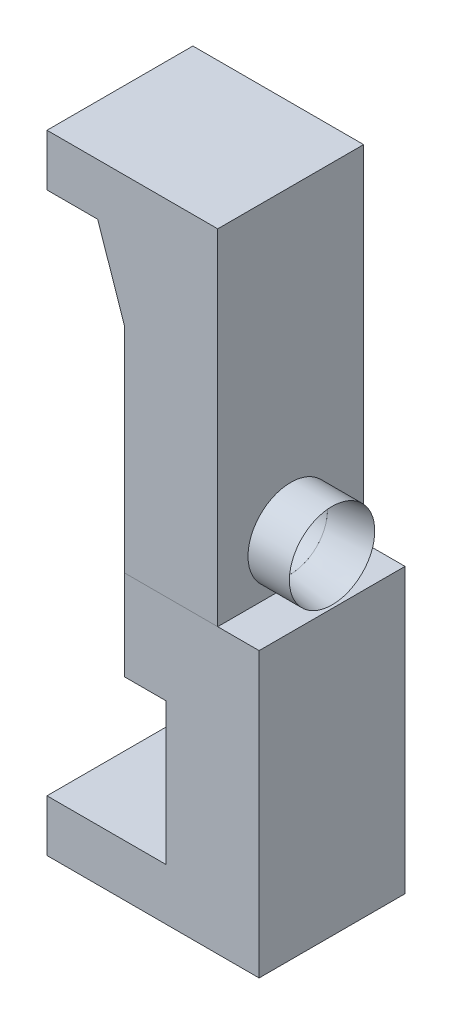
ISO-10303-21;
HEADER;
FILE_DESCRIPTION(('STEP AP214'),'2;1');
FILE_NAME('part.step','',(''),(''),'','','');
FILE_SCHEMA(('AUTOMOTIVE_DESIGN { 1 0 10303 214 1 1 1 1 }'));
ENDSEC;
DATA;
#1=APPLICATION_CONTEXT('core data for automotive mechanical design processes');
#2=APPLICATION_PROTOCOL_DEFINITION('international standard','automotive_design',2000,#1);
#3=PRODUCT_CONTEXT('',#1,'mechanical');
#4=PRODUCT('Part','Part','',(#3));
#5=PRODUCT_RELATED_PRODUCT_CATEGORY('part','',(#4));
#6=PRODUCT_DEFINITION_FORMATION('','',#4);
#7=PRODUCT_DEFINITION_CONTEXT('part definition',#1,'design');
#8=PRODUCT_DEFINITION('design','',#6,#7);
#9=PRODUCT_DEFINITION_SHAPE('','',#8);
#10=(LENGTH_UNIT() NAMED_UNIT(*) SI_UNIT(.MILLI.,.METRE.));
#11=(NAMED_UNIT(*) PLANE_ANGLE_UNIT() SI_UNIT($,.RADIAN.));
#12=(NAMED_UNIT(*) SI_UNIT($,.STERADIAN.) SOLID_ANGLE_UNIT());
#13=UNCERTAINTY_MEASURE_WITH_UNIT(LENGTH_MEASURE(1.E-05),#10,'distance_accuracy_value','');
#14=(GEOMETRIC_REPRESENTATION_CONTEXT(3) GLOBAL_UNCERTAINTY_ASSIGNED_CONTEXT((#13)) GLOBAL_UNIT_ASSIGNED_CONTEXT((#10,
#11,#12)) REPRESENTATION_CONTEXT('',''));
#15=CARTESIAN_POINT('',(0.,0.,0.));
#16=DIRECTION('',(0.,0.,1.));
#17=DIRECTION('',(1.,0.,0.));
#18=AXIS2_PLACEMENT_3D('',#15,#16,#17);
#19=CARTESIAN_POINT('',(0.,28.875,7.05));
#20=DIRECTION('',(0.,1.,0.));
#21=DIRECTION('',(0.,0.,1.));
#22=AXIS2_PLACEMENT_3D('',#19,#20,#21);
#23=PLANE('',#22);
#24=DIRECTION('',(1.,0.,0.));
#25=VECTOR('',#24,1.);
#26=CARTESIAN_POINT('',(0.,28.875,-7.05));
#27=LINE('',#26,#25);
#28=CARTESIAN_POINT('',(-7.5,28.875,-7.05));
#29=VERTEX_POINT('',#28);
#30=CARTESIAN_POINT('',(8.99999999999999,28.875,-7.05));
#31=VERTEX_POINT('',#30);
#32=EDGE_CURVE('E137',#29,#31,#27,.T.);
#33=ORIENTED_EDGE('',*,*,#32,.F.);
#34=DIRECTION('',(0.,0.,-1.));
#35=VECTOR('',#34,1.);
#36=CARTESIAN_POINT('',(-7.5,28.875,7.05));
#37=LINE('',#36,#35);
#38=CARTESIAN_POINT('',(-7.5,28.875,7.05));
#39=VERTEX_POINT('',#38);
#40=EDGE_CURVE('E12',#39,#29,#37,.T.);
#41=ORIENTED_EDGE('',*,*,#40,.F.);
#42=DIRECTION('',(1.,0.,0.));
#43=VECTOR('',#42,1.);
#44=CARTESIAN_POINT('',(0.,28.875,7.05));
#45=LINE('',#44,#43);
#46=CARTESIAN_POINT('',(8.99999999999999,28.875,7.05));
#47=VERTEX_POINT('',#46);
#48=EDGE_CURVE('E176',#39,#47,#45,.T.);
#49=ORIENTED_EDGE('',*,*,#48,.T.);
#50=DIRECTION('',(0.,0.,1.));
#51=VECTOR('',#50,1.);
#52=CARTESIAN_POINT('',(8.99999999999999,28.875,0.));
#53=LINE('',#52,#51);
#54=EDGE_CURVE('E129',#31,#47,#53,.T.);
#55=ORIENTED_EDGE('',*,*,#54,.F.);
#56=EDGE_LOOP('',(#33,#41,#49,#55));
#57=FACE_BOUND('',#56,.T.);
#58=ADVANCED_FACE('F48',(#57),#23,.T.);
#59=CARTESIAN_POINT('',(-7.5,0.,7.05));
#60=DIRECTION('',(-1.,0.,0.));
#61=DIRECTION('',(0.,0.,1.));
#62=AXIS2_PLACEMENT_3D('',#59,#60,#61);
#63=PLANE('',#62);
#64=DIRECTION('',(0.,1.,0.));
#65=VECTOR('',#64,1.);
#66=CARTESIAN_POINT('',(-7.5,0.,-7.05));
#67=LINE('',#66,#65);
#68=CARTESIAN_POINT('',(-7.5,23.875,-7.05));
#69=VERTEX_POINT('',#68);
#70=EDGE_CURVE('E139',#69,#29,#67,.T.);
#71=ORIENTED_EDGE('',*,*,#70,.F.);
#72=DIRECTION('',(0.,0.,-1.));
#73=VECTOR('',#72,1.);
#74=CARTESIAN_POINT('',(-7.5,23.875,7.05));
#75=LINE('',#74,#73);
#76=CARTESIAN_POINT('',(-7.5,23.875,7.05));
#77=VERTEX_POINT('',#76);
#78=EDGE_CURVE('E57',#77,#69,#75,.T.);
#79=ORIENTED_EDGE('',*,*,#78,.F.);
#80=DIRECTION('',(0.,1.,0.));
#81=VECTOR('',#80,1.);
#82=CARTESIAN_POINT('',(-7.5,0.,7.05));
#83=LINE('',#82,#81);
#84=EDGE_CURVE('E177',#77,#39,#83,.T.);
#85=ORIENTED_EDGE('',*,*,#84,.T.);
#86=ORIENTED_EDGE('',*,*,#40,.T.);
#87=EDGE_LOOP('',(#71,#79,#85,#86));
#88=FACE_BOUND('',#87,.T.);
#89=ADVANCED_FACE('F184',(#88),#63,.T.);
#90=CARTESIAN_POINT('',(0.,23.875,7.05));
#91=DIRECTION('',(0.,-1.,0.));
#92=DIRECTION('',(0.,0.,-1.));
#93=AXIS2_PLACEMENT_3D('',#90,#91,#92);
#94=PLANE('',#93);
#95=DIRECTION('',(-1.,0.,0.));
#96=VECTOR('',#95,1.);
#97=CARTESIAN_POINT('',(0.,23.875,-7.05));
#98=LINE('',#97,#96);
#99=CARTESIAN_POINT('',(-2.6,23.875,-7.05));
#100=VERTEX_POINT('',#99);
#101=EDGE_CURVE('E173',#100,#69,#98,.T.);
#102=ORIENTED_EDGE('',*,*,#101,.F.);
#103=DIRECTION('',(0.,0.,-1.));
#104=VECTOR('',#103,1.);
#105=CARTESIAN_POINT('',(-2.6,23.875,7.05));
#106=LINE('',#105,#104);
#107=CARTESIAN_POINT('',(-2.6,23.875,7.05));
#108=VERTEX_POINT('',#107);
#109=EDGE_CURVE('E84',#108,#100,#106,.T.);
#110=ORIENTED_EDGE('',*,*,#109,.F.);
#111=DIRECTION('',(-1.,0.,0.));
#112=VECTOR('',#111,1.);
#113=CARTESIAN_POINT('',(0.,23.875,7.05));
#114=LINE('',#113,#112);
#115=EDGE_CURVE('E166',#108,#77,#114,.T.);
#116=ORIENTED_EDGE('',*,*,#115,.T.);
#117=ORIENTED_EDGE('',*,*,#78,.T.);
#118=EDGE_LOOP('',(#102,#110,#116,#117));
#119=FACE_BOUND('',#118,.T.);
#120=ADVANCED_FACE('F186',(#119),#94,.T.);
#121=CARTESIAN_POINT('',(4.94336537356872,1.68009803546127,7.05));
#122=DIRECTION('',(-0.946810458349171,-0.321791789765731,0.));
#123=DIRECTION('',(0.321791789765731,-0.946810458349171,0.));
#124=AXIS2_PLACEMENT_3D('',#121,#122,#123);
#125=PLANE('',#124);
#126=DIRECTION('',(-0.321791789765731,0.946810458349171,0.));
#127=VECTOR('',#126,1.);
#128=CARTESIAN_POINT('',(4.94336537356872,1.68009803546127,-7.05));
#129=LINE('',#128,#127);
#130=CARTESIAN_POINT('',(0.,16.225,-7.05));
#131=VERTEX_POINT('',#130);
#132=EDGE_CURVE('E160',#131,#100,#129,.T.);
#133=ORIENTED_EDGE('',*,*,#132,.F.);
#134=DIRECTION('',(0.,0.,-1.));
#135=VECTOR('',#134,1.);
#136=CARTESIAN_POINT('',(0.,16.225,7.05));
#137=LINE('',#136,#135);
#138=CARTESIAN_POINT('',(0.,16.225,7.05));
#139=VERTEX_POINT('',#138);
#140=EDGE_CURVE('E66',#139,#131,#137,.T.);
#141=ORIENTED_EDGE('',*,*,#140,.F.);
#142=DIRECTION('',(-0.321791789765731,0.946810458349171,0.));
#143=VECTOR('',#142,1.);
#144=CARTESIAN_POINT('',(4.94336537356872,1.68009803546127,7.05));
#145=LINE('',#144,#143);
#146=EDGE_CURVE('E163',#139,#108,#145,.T.);
#147=ORIENTED_EDGE('',*,*,#146,.T.);
#148=ORIENTED_EDGE('',*,*,#109,.T.);
#149=EDGE_LOOP('',(#133,#141,#147,#148));
#150=FACE_BOUND('',#149,.T.);
#151=ADVANCED_FACE('F188',(#150),#125,.T.);
#152=CARTESIAN_POINT('',(0.,0.,7.05));
#153=DIRECTION('',(0.,0.,1.));
#154=DIRECTION('',(1.,0.,0.));
#155=AXIS2_PLACEMENT_3D('',#152,#153,#154);
#156=PLANE('',#155);
#157=ORIENTED_EDGE('',*,*,#146,.F.);
#158=DIRECTION('',(0.,-1.,0.));
#159=VECTOR('',#158,1.);
#160=CARTESIAN_POINT('',(0.,0.,7.05));
#161=LINE('',#160,#159);
#162=CARTESIAN_POINT('',(0.,-4.425,7.05));
#163=VERTEX_POINT('',#162);
#164=EDGE_CURVE('E135',#139,#163,#161,.T.);
#165=ORIENTED_EDGE('',*,*,#164,.T.);
#166=DIRECTION('',(-1.,0.,0.));
#167=VECTOR('',#166,1.);
#168=CARTESIAN_POINT('',(9.,-4.425,7.05));
#169=LINE('',#168,#167);
#170=CARTESIAN_POINT('',(9.,-4.425,7.05));
#171=VERTEX_POINT('',#170);
#172=EDGE_CURVE('E116',#171,#163,#169,.T.);
#173=ORIENTED_EDGE('',*,*,#172,.F.);
#174=DIRECTION('',(0.,-1.,0.));
#175=VECTOR('',#174,1.);
#176=CARTESIAN_POINT('',(9.,0.,7.05));
#177=LINE('',#176,#175);
#178=EDGE_CURVE('E123',#47,#171,#177,.T.);
#179=ORIENTED_EDGE('',*,*,#178,.F.);
#180=ORIENTED_EDGE('',*,*,#48,.F.);
#181=ORIENTED_EDGE('',*,*,#84,.F.);
#182=ORIENTED_EDGE('',*,*,#115,.F.);
#183=EDGE_LOOP('',(#157,#165,#173,#179,#180,#181,#182));
#184=FACE_BOUND('',#183,.T.);
#185=ADVANCED_FACE('F133',(#184),#156,.T.);
#186=CARTESIAN_POINT('',(0.,0.,-7.05));
#187=DIRECTION('',(0.,0.,1.));
#188=DIRECTION('',(1.,0.,0.));
#189=AXIS2_PLACEMENT_3D('',#186,#187,#188);
#190=PLANE('',#189);
#191=ORIENTED_EDGE('',*,*,#32,.T.);
#192=DIRECTION('',(0.,1.,0.));
#193=VECTOR('',#192,1.);
#194=CARTESIAN_POINT('',(9.,0.,-7.05));
#195=LINE('',#194,#193);
#196=CARTESIAN_POINT('',(9.,-4.425,-7.05));
#197=VERTEX_POINT('',#196);
#198=EDGE_CURVE('E122',#197,#31,#195,.T.);
#199=ORIENTED_EDGE('',*,*,#198,.F.);
#200=DIRECTION('',(-1.,0.,0.));
#201=VECTOR('',#200,1.);
#202=CARTESIAN_POINT('',(9.,-4.425,-7.05));
#203=LINE('',#202,#201);
#204=CARTESIAN_POINT('',(0.,-4.425,-7.05));
#205=VERTEX_POINT('',#204);
#206=EDGE_CURVE('E118',#197,#205,#203,.T.);
#207=ORIENTED_EDGE('',*,*,#206,.T.);
#208=DIRECTION('',(0.,1.,0.));
#209=VECTOR('',#208,1.);
#210=CARTESIAN_POINT('',(0.,0.,-7.05));
#211=LINE('',#210,#209);
#212=EDGE_CURVE('E131',#205,#131,#211,.T.);
#213=ORIENTED_EDGE('',*,*,#212,.T.);
#214=ORIENTED_EDGE('',*,*,#132,.T.);
#215=ORIENTED_EDGE('',*,*,#101,.T.);
#216=ORIENTED_EDGE('',*,*,#70,.T.);
#217=EDGE_LOOP('',(#191,#199,#207,#213,#214,#215,#216));
#218=FACE_BOUND('',#217,.T.);
#219=ADVANCED_FACE('F158',(#218),#190,.F.);
#220=CARTESIAN_POINT('',(0.,0.,0.));
#221=DIRECTION('',(1.,0.,0.));
#222=DIRECTION('',(0.,1.,0.));
#223=AXIS2_PLACEMENT_3D('',#220,#221,#222);
#224=PLANE('',#223);
#225=CARTESIAN_POINT('',(0.,0.,0.));
#226=DIRECTION('',(1.,0.,0.));
#227=DIRECTION('',(0.,1.,0.));
#228=AXIS2_PLACEMENT_3D('',#225,#226,#227);
#229=CIRCLE('',#228,3.55);
#230=CARTESIAN_POINT('',(0.,3.55,0.));
#231=VERTEX_POINT('',#230);
#232=EDGE_CURVE('E147',#231,#231,#229,.T.);
#233=ORIENTED_EDGE('',*,*,#232,.T.);
#234=EDGE_LOOP('',(#233));
#235=FACE_BOUND('',#234,.T.);
#236=ORIENTED_EDGE('',*,*,#164,.F.);
#237=ORIENTED_EDGE('',*,*,#140,.T.);
#238=ORIENTED_EDGE('',*,*,#212,.F.);
#239=DIRECTION('',(0.,0.,-1.));
#240=VECTOR('',#239,1.);
#241=CARTESIAN_POINT('',(0.,-4.425,0.));
#242=LINE('',#241,#240);
#243=EDGE_CURVE('E146',#163,#205,#242,.T.);
#244=ORIENTED_EDGE('',*,*,#243,.F.);
#245=EDGE_LOOP('',(#236,#237,#238,#244));
#246=FACE_BOUND('',#245,.T.);
#247=ADVANCED_FACE('F162',(#235,#246),#224,.F.);
#248=CARTESIAN_POINT('',(9.,-4.425,0.));
#249=DIRECTION('',(0.,1.,0.));
#250=DIRECTION('',(-1.,0.,0.));
#251=AXIS2_PLACEMENT_3D('',#248,#249,#250);
#252=PLANE('',#251);
#253=ORIENTED_EDGE('',*,*,#243,.T.);
#254=ORIENTED_EDGE('',*,*,#206,.F.);
#255=DIRECTION('',(0.,0.,-1.));
#256=VECTOR('',#255,1.);
#257=CARTESIAN_POINT('',(9.,-4.425,0.));
#258=LINE('',#257,#256);
#259=EDGE_CURVE('E112',#171,#197,#258,.T.);
#260=ORIENTED_EDGE('',*,*,#259,.F.);
#261=ORIENTED_EDGE('',*,*,#172,.T.);
#262=EDGE_LOOP('',(#253,#254,#260,#261));
#263=FACE_BOUND('',#262,.T.);
#264=ADVANCED_FACE('F114',(#263),#252,.F.);
#265=CARTESIAN_POINT('',(9.,0.,0.));
#266=DIRECTION('',(1.,0.,0.));
#267=DIRECTION('',(0.,1.,0.));
#268=AXIS2_PLACEMENT_3D('',#265,#266,#267);
#269=PLANE('',#268);
#270=CARTESIAN_POINT('',(9.,0.,0.));
#271=DIRECTION('',(1.,0.,0.));
#272=DIRECTION('',(0.,1.,0.));
#273=AXIS2_PLACEMENT_3D('',#270,#271,#272);
#274=CIRCLE('',#273,3.55);
#275=CARTESIAN_POINT('',(9.,3.55,0.));
#276=VERTEX_POINT('',#275);
#277=EDGE_CURVE('E199',#276,#276,#274,.T.);
#278=ORIENTED_EDGE('',*,*,#277,.F.);
#279=EDGE_LOOP('',(#278));
#280=FACE_BOUND('',#279,.T.);
#281=ORIENTED_EDGE('',*,*,#178,.T.);
#282=ORIENTED_EDGE('',*,*,#259,.T.);
#283=ORIENTED_EDGE('',*,*,#198,.T.);
#284=ORIENTED_EDGE('',*,*,#54,.T.);
#285=EDGE_LOOP('',(#281,#282,#283,#284));
#286=FACE_BOUND('',#285,.T.);
#287=ADVANCED_FACE('F127',(#280,#286),#269,.T.);
#288=CARTESIAN_POINT('',(0.,0.,0.));
#289=DIRECTION('',(1.,0.,0.));
#290=DIRECTION('',(0.,1.,0.));
#291=AXIS2_PLACEMENT_3D('',#288,#289,#290);
#292=CYLINDRICAL_SURFACE('',#291,3.55);
#293=ORIENTED_EDGE('',*,*,#232,.F.);
#294=EDGE_LOOP('',(#293));
#295=FACE_BOUND('',#294,.T.);
#296=ORIENTED_EDGE('',*,*,#277,.T.);
#297=EDGE_LOOP('',(#296));
#298=FACE_BOUND('',#297,.T.);
#299=ADVANCED_FACE('F206',(#295,#298),#292,.F.);
#300=CLOSED_SHELL('',(#58,#89,#120,#151,#185,#219,#247,#264,#287,#299));
#301=MANIFOLD_SOLID_BREP('B2',#300);
#302=CARTESIAN_POINT('',(0.,-4.425,7.05));
#303=DIRECTION('',(0.,1.,0.));
#304=DIRECTION('',(0.,0.,1.));
#305=AXIS2_PLACEMENT_3D('',#302,#303,#304);
#306=PLANE('',#305);
#307=DIRECTION('',(1.,0.,0.));
#308=VECTOR('',#307,1.);
#309=CARTESIAN_POINT('',(0.,-4.425,-7.05));
#310=LINE('',#309,#308);
#311=CARTESIAN_POINT('',(0.,-4.425,-7.05));
#312=VERTEX_POINT('',#311);
#313=CARTESIAN_POINT('',(13.,-4.425,-7.05));
#314=VERTEX_POINT('',#313);
#315=EDGE_CURVE('E405',#312,#314,#310,.T.);
#316=ORIENTED_EDGE('',*,*,#315,.F.);
#317=DIRECTION('',(0.,0.,-1.));
#318=VECTOR('',#317,1.);
#319=CARTESIAN_POINT('',(0.,-4.425,7.05));
#320=LINE('',#319,#318);
#321=CARTESIAN_POINT('',(0.,-4.425,7.05));
#322=VERTEX_POINT('',#321);
#323=EDGE_CURVE('E46',#322,#312,#320,.T.);
#324=ORIENTED_EDGE('',*,*,#323,.F.);
#325=DIRECTION('',(1.,0.,0.));
#326=VECTOR('',#325,1.);
#327=CARTESIAN_POINT('',(0.,-4.425,7.05));
#328=LINE('',#327,#326);
#329=CARTESIAN_POINT('',(13.,-4.425,7.05));
#330=VERTEX_POINT('',#329);
#331=EDGE_CURVE('E422',#322,#330,#328,.T.);
#332=ORIENTED_EDGE('',*,*,#331,.T.);
#333=DIRECTION('',(0.,0.,-1.));
#334=VECTOR('',#333,1.);
#335=CARTESIAN_POINT('',(13.,-4.425,7.05));
#336=LINE('',#335,#334);
#337=EDGE_CURVE('E362',#330,#314,#336,.T.);
#338=ORIENTED_EDGE('',*,*,#337,.T.);
#339=EDGE_LOOP('',(#316,#324,#332,#338));
#340=FACE_BOUND('',#339,.T.);
#341=ADVANCED_FACE('F312',(#340),#306,.T.);
#342=CARTESIAN_POINT('',(0.,0.,7.05));
#343=DIRECTION('',(-1.,0.,0.));
#344=DIRECTION('',(0.,0.,1.));
#345=AXIS2_PLACEMENT_3D('',#342,#343,#344);
#346=PLANE('',#345);
#347=DIRECTION('',(0.,1.,0.));
#348=VECTOR('',#347,1.);
#349=CARTESIAN_POINT('',(0.,0.,-7.05));
#350=LINE('',#349,#348);
#351=CARTESIAN_POINT('',(0.,-13.125,-7.05));
#352=VERTEX_POINT('',#351);
#353=EDGE_CURVE('E408',#352,#312,#350,.T.);
#354=ORIENTED_EDGE('',*,*,#353,.F.);
#355=DIRECTION('',(0.,0.,-1.));
#356=VECTOR('',#355,1.);
#357=CARTESIAN_POINT('',(0.,-13.125,7.05));
#358=LINE('',#357,#356);
#359=CARTESIAN_POINT('',(0.,-13.125,7.05));
#360=VERTEX_POINT('',#359);
#361=EDGE_CURVE('E320',#360,#352,#358,.T.);
#362=ORIENTED_EDGE('',*,*,#361,.F.);
#363=DIRECTION('',(0.,1.,0.));
#364=VECTOR('',#363,1.);
#365=CARTESIAN_POINT('',(0.,0.,7.05));
#366=LINE('',#365,#364);
#367=EDGE_CURVE('E446',#360,#322,#366,.T.);
#368=ORIENTED_EDGE('',*,*,#367,.T.);
#369=ORIENTED_EDGE('',*,*,#323,.T.);
#370=EDGE_LOOP('',(#354,#362,#368,#369));
#371=FACE_BOUND('',#370,.T.);
#372=ADVANCED_FACE('F445',(#371),#346,.T.);
#373=CARTESIAN_POINT('',(0.,-13.125,7.05));
#374=DIRECTION('',(0.,1.,0.));
#375=DIRECTION('',(0.,0.,1.));
#376=AXIS2_PLACEMENT_3D('',#373,#374,#375);
#377=PLANE('',#376);
#378=DIRECTION('',(1.,0.,0.));
#379=VECTOR('',#378,1.);
#380=CARTESIAN_POINT('',(0.,-13.125,-7.05));
#381=LINE('',#380,#379);
#382=CARTESIAN_POINT('',(4.,-13.125,-7.05));
#383=VERTEX_POINT('',#382);
#384=EDGE_CURVE('E411',#352,#383,#381,.T.);
#385=ORIENTED_EDGE('',*,*,#384,.T.);
#386=DIRECTION('',(0.,0.,-1.));
#387=VECTOR('',#386,1.);
#388=CARTESIAN_POINT('',(4.,-13.125,7.05));
#389=LINE('',#388,#387);
#390=CARTESIAN_POINT('',(4.,-13.125,7.05));
#391=VERTEX_POINT('',#390);
#392=EDGE_CURVE('E429',#391,#383,#389,.T.);
#393=ORIENTED_EDGE('',*,*,#392,.F.);
#394=DIRECTION('',(1.,0.,0.));
#395=VECTOR('',#394,1.);
#396=CARTESIAN_POINT('',(0.,-13.125,7.05));
#397=LINE('',#396,#395);
#398=EDGE_CURVE('E436',#360,#391,#397,.T.);
#399=ORIENTED_EDGE('',*,*,#398,.F.);
#400=ORIENTED_EDGE('',*,*,#361,.T.);
#401=EDGE_LOOP('',(#385,#393,#399,#400));
#402=FACE_BOUND('',#401,.T.);
#403=ADVANCED_FACE('F434',(#402),#377,.F.);
#404=CARTESIAN_POINT('',(4.,0.,7.05));
#405=DIRECTION('',(1.,0.,0.));
#406=DIRECTION('',(0.,1.,0.));
#407=AXIS2_PLACEMENT_3D('',#404,#405,#406);
#408=PLANE('',#407);
#409=DIRECTION('',(0.,-1.,0.));
#410=VECTOR('',#409,1.);
#411=CARTESIAN_POINT('',(4.,0.,-7.05));
#412=LINE('',#411,#410);
#413=CARTESIAN_POINT('',(4.,-26.825,-7.05));
#414=VERTEX_POINT('',#413);
#415=EDGE_CURVE('E413',#383,#414,#412,.T.);
#416=ORIENTED_EDGE('',*,*,#415,.T.);
#417=DIRECTION('',(0.,0.,-1.));
#418=VECTOR('',#417,1.);
#419=CARTESIAN_POINT('',(4.,-26.825,7.05));
#420=LINE('',#419,#418);
#421=CARTESIAN_POINT('',(4.,-26.825,7.05));
#422=VERTEX_POINT('',#421);
#423=EDGE_CURVE('E426',#422,#414,#420,.T.);
#424=ORIENTED_EDGE('',*,*,#423,.F.);
#425=DIRECTION('',(0.,-1.,0.));
#426=VECTOR('',#425,1.);
#427=CARTESIAN_POINT('',(4.,0.,7.05));
#428=LINE('',#427,#426);
#429=EDGE_CURVE('E400',#391,#422,#428,.T.);
#430=ORIENTED_EDGE('',*,*,#429,.F.);
#431=ORIENTED_EDGE('',*,*,#392,.T.);
#432=EDGE_LOOP('',(#416,#424,#430,#431));
#433=FACE_BOUND('',#432,.T.);
#434=ADVANCED_FACE('F456',(#433),#408,.F.);
#435=CARTESIAN_POINT('',(0.,-26.825,7.05));
#436=DIRECTION('',(0.,-1.,0.));
#437=DIRECTION('',(0.,0.,-1.));
#438=AXIS2_PLACEMENT_3D('',#435,#436,#437);
#439=PLANE('',#438);
#440=DIRECTION('',(-1.,0.,0.));
#441=VECTOR('',#440,1.);
#442=CARTESIAN_POINT('',(0.,-26.825,-7.05));
#443=LINE('',#442,#441);
#444=CARTESIAN_POINT('',(-7.5,-26.825,-7.05));
#445=VERTEX_POINT('',#444);
#446=EDGE_CURVE('E415',#414,#445,#443,.T.);
#447=ORIENTED_EDGE('',*,*,#446,.T.);
#448=DIRECTION('',(0.,0.,-1.));
#449=VECTOR('',#448,1.);
#450=CARTESIAN_POINT('',(-7.5,-26.825,7.05));
#451=LINE('',#450,#449);
#452=CARTESIAN_POINT('',(-7.5,-26.825,7.05));
#453=VERTEX_POINT('',#452);
#454=EDGE_CURVE('E389',#453,#445,#451,.T.);
#455=ORIENTED_EDGE('',*,*,#454,.F.);
#456=DIRECTION('',(-1.,0.,0.));
#457=VECTOR('',#456,1.);
#458=CARTESIAN_POINT('',(0.,-26.825,7.05));
#459=LINE('',#458,#457);
#460=EDGE_CURVE('E397',#422,#453,#459,.T.);
#461=ORIENTED_EDGE('',*,*,#460,.F.);
#462=ORIENTED_EDGE('',*,*,#423,.T.);
#463=EDGE_LOOP('',(#447,#455,#461,#462));
#464=FACE_BOUND('',#463,.T.);
#465=ADVANCED_FACE('F458',(#464),#439,.F.);
#466=CARTESIAN_POINT('',(-7.5,0.,7.05));
#467=DIRECTION('',(-1.,0.,0.));
#468=DIRECTION('',(0.,0.,1.));
#469=AXIS2_PLACEMENT_3D('',#466,#467,#468);
#470=PLANE('',#469);
#471=DIRECTION('',(0.,1.,0.));
#472=VECTOR('',#471,1.);
#473=CARTESIAN_POINT('',(-7.5,0.,-7.05));
#474=LINE('',#473,#472);
#475=CARTESIAN_POINT('',(-7.5,-31.825,-7.05));
#476=VERTEX_POINT('',#475);
#477=EDGE_CURVE('E388',#476,#445,#474,.T.);
#478=ORIENTED_EDGE('',*,*,#477,.F.);
#479=DIRECTION('',(0.,0.,-1.));
#480=VECTOR('',#479,1.);
#481=CARTESIAN_POINT('',(-7.5,-31.825,7.05));
#482=LINE('',#481,#480);
#483=CARTESIAN_POINT('',(-7.5,-31.825,7.05));
#484=VERTEX_POINT('',#483);
#485=EDGE_CURVE('E382',#484,#476,#482,.T.);
#486=ORIENTED_EDGE('',*,*,#485,.F.);
#487=DIRECTION('',(0.,1.,0.));
#488=VECTOR('',#487,1.);
#489=CARTESIAN_POINT('',(-7.5,0.,7.05));
#490=LINE('',#489,#488);
#491=EDGE_CURVE('E386',#484,#453,#490,.T.);
#492=ORIENTED_EDGE('',*,*,#491,.T.);
#493=ORIENTED_EDGE('',*,*,#454,.T.);
#494=EDGE_LOOP('',(#478,#486,#492,#493));
#495=FACE_BOUND('',#494,.T.);
#496=ADVANCED_FACE('F384',(#495),#470,.T.);
#497=CARTESIAN_POINT('',(0.,-31.825,7.05));
#498=DIRECTION('',(0.,1.,0.));
#499=DIRECTION('',(0.,0.,1.));
#500=AXIS2_PLACEMENT_3D('',#497,#498,#499);
#501=PLANE('',#500);
#502=DIRECTION('',(1.,0.,0.));
#503=VECTOR('',#502,1.);
#504=CARTESIAN_POINT('',(0.,-31.825,-7.05));
#505=LINE('',#504,#503);
#506=CARTESIAN_POINT('',(13.,-31.825,-7.05));
#507=VERTEX_POINT('',#506);
#508=EDGE_CURVE('E355',#476,#507,#505,.T.);
#509=ORIENTED_EDGE('',*,*,#508,.T.);
#510=DIRECTION('',(0.,0.,-1.));
#511=VECTOR('',#510,1.);
#512=CARTESIAN_POINT('',(13.,-31.825,7.05));
#513=LINE('',#512,#511);
#514=CARTESIAN_POINT('',(13.,-31.825,7.05));
#515=VERTEX_POINT('',#514);
#516=EDGE_CURVE('E390',#515,#507,#513,.T.);
#517=ORIENTED_EDGE('',*,*,#516,.F.);
#518=DIRECTION('',(1.,0.,0.));
#519=VECTOR('',#518,1.);
#520=CARTESIAN_POINT('',(0.,-31.825,7.05));
#521=LINE('',#520,#519);
#522=EDGE_CURVE('E392',#484,#515,#521,.T.);
#523=ORIENTED_EDGE('',*,*,#522,.F.);
#524=ORIENTED_EDGE('',*,*,#485,.T.);
#525=EDGE_LOOP('',(#509,#517,#523,#524));
#526=FACE_BOUND('',#525,.T.);
#527=ADVANCED_FACE('F393',(#526),#501,.F.);
#528=CARTESIAN_POINT('',(13.,0.,7.05));
#529=DIRECTION('',(-1.,0.,0.));
#530=DIRECTION('',(0.,0.,1.));
#531=AXIS2_PLACEMENT_3D('',#528,#529,#530);
#532=PLANE('',#531);
#533=DIRECTION('',(0.,1.,0.));
#534=VECTOR('',#533,1.);
#535=CARTESIAN_POINT('',(13.,0.,-7.05));
#536=LINE('',#535,#534);
#537=EDGE_CURVE('E420',#507,#314,#536,.T.);
#538=ORIENTED_EDGE('',*,*,#537,.T.);
#539=ORIENTED_EDGE('',*,*,#337,.F.);
#540=DIRECTION('',(0.,1.,0.));
#541=VECTOR('',#540,1.);
#542=CARTESIAN_POINT('',(13.,0.,7.05));
#543=LINE('',#542,#541);
#544=EDGE_CURVE('E328',#515,#330,#543,.T.);
#545=ORIENTED_EDGE('',*,*,#544,.F.);
#546=ORIENTED_EDGE('',*,*,#516,.T.);
#547=EDGE_LOOP('',(#538,#539,#545,#546));
#548=FACE_BOUND('',#547,.T.);
#549=ADVANCED_FACE('F449',(#548),#532,.F.);
#550=CARTESIAN_POINT('',(0.,0.,7.05));
#551=DIRECTION('',(0.,0.,1.));
#552=DIRECTION('',(1.,0.,0.));
#553=AXIS2_PLACEMENT_3D('',#550,#551,#552);
#554=PLANE('',#553);
#555=ORIENTED_EDGE('',*,*,#331,.F.);
#556=ORIENTED_EDGE('',*,*,#367,.F.);
#557=ORIENTED_EDGE('',*,*,#398,.T.);
#558=ORIENTED_EDGE('',*,*,#429,.T.);
#559=ORIENTED_EDGE('',*,*,#460,.T.);
#560=ORIENTED_EDGE('',*,*,#491,.F.);
#561=ORIENTED_EDGE('',*,*,#522,.T.);
#562=ORIENTED_EDGE('',*,*,#544,.T.);
#563=EDGE_LOOP('',(#555,#556,#557,#558,#559,#560,#561,#562));
#564=FACE_BOUND('',#563,.T.);
#565=ADVANCED_FACE('F395',(#564),#554,.T.);
#566=CARTESIAN_POINT('',(0.,0.,-7.05));
#567=DIRECTION('',(0.,0.,1.));
#568=DIRECTION('',(1.,0.,0.));
#569=AXIS2_PLACEMENT_3D('',#566,#567,#568);
#570=PLANE('',#569);
#571=ORIENTED_EDGE('',*,*,#315,.T.);
#572=ORIENTED_EDGE('',*,*,#537,.F.);
#573=ORIENTED_EDGE('',*,*,#508,.F.);
#574=ORIENTED_EDGE('',*,*,#477,.T.);
#575=ORIENTED_EDGE('',*,*,#446,.F.);
#576=ORIENTED_EDGE('',*,*,#415,.F.);
#577=ORIENTED_EDGE('',*,*,#384,.F.);
#578=ORIENTED_EDGE('',*,*,#353,.T.);
#579=EDGE_LOOP('',(#571,#572,#573,#574,#575,#576,#577,#578));
#580=FACE_BOUND('',#579,.T.);
#581=ADVANCED_FACE('F443',(#580),#570,.F.);
#582=CLOSED_SHELL('',(#341,#372,#403,#434,#465,#496,#527,#549,#565,#581));
#583=MANIFOLD_SOLID_BREP('B6',#582);
#584=CARTESIAN_POINT('',(9.,4.125,0.));
#585=DIRECTION('',(1.,0.,0.));
#586=DIRECTION('',(0.,0.,-1.));
#587=AXIS2_PLACEMENT_3D('',#584,#585,#586);
#588=PLANE('',#587);
#589=CARTESIAN_POINT('',(9.,0.,0.));
#590=DIRECTION('',(-1.,0.,0.));
#591=DIRECTION('',(0.,0.,1.));
#592=AXIS2_PLACEMENT_3D('',#589,#590,#591);
#593=CIRCLE('',#592,3.55);
#594=CARTESIAN_POINT('',(9.,0.,3.55));
#595=VERTEX_POINT('',#594);
#596=EDGE_CURVE('E311',#595,#595,#593,.T.);
#597=ORIENTED_EDGE('',*,*,#596,.F.);
#598=EDGE_LOOP('',(#597));
#599=FACE_BOUND('',#598,.T.);
#600=CARTESIAN_POINT('',(9.,0.,0.));
#601=DIRECTION('',(-1.,0.,0.));
#602=DIRECTION('',(0.,0.,1.));
#603=AXIS2_PLACEMENT_3D('',#600,#601,#602);
#604=CIRCLE('',#603,4.125);
#605=CARTESIAN_POINT('',(9.,0.,4.125));
#606=VERTEX_POINT('',#605);
#607=EDGE_CURVE('E550',#606,#606,#604,.T.);
#608=ORIENTED_EDGE('',*,*,#607,.T.);
#609=EDGE_LOOP('',(#608));
#610=FACE_BOUND('',#609,.T.);
#611=ADVANCED_FACE('F540',(#599,#610),#588,.F.);
#612=CARTESIAN_POINT('',(9.,0.,0.));
#613=DIRECTION('',(1.,0.,0.));
#614=DIRECTION('',(0.,0.,-1.));
#615=AXIS2_PLACEMENT_3D('',#612,#613,#614);
#616=CONICAL_SURFACE('',#615,3.55,0.142771945019611);
#617=CARTESIAN_POINT('',(13.,0.,0.));
#618=DIRECTION('',(-1.,0.,0.));
#619=DIRECTION('',(0.,0.,1.));
#620=AXIS2_PLACEMENT_3D('',#617,#618,#619);
#621=CIRCLE('',#620,4.125);
#622=CARTESIAN_POINT('',(13.,0.,4.125));
#623=VERTEX_POINT('',#622);
#624=EDGE_CURVE('E546',#623,#623,#621,.T.);
#625=ORIENTED_EDGE('',*,*,#624,.F.);
#626=EDGE_LOOP('',(#625));
#627=FACE_BOUND('',#626,.T.);
#628=ORIENTED_EDGE('',*,*,#596,.T.);
#629=EDGE_LOOP('',(#628));
#630=FACE_BOUND('',#629,.T.);
#631=ADVANCED_FACE('F560',(#627,#630),#616,.F.);
#632=CARTESIAN_POINT('',(9.,0.,0.));
#633=DIRECTION('',(-1.,0.,0.));
#634=DIRECTION('',(0.,0.,1.));
#635=AXIS2_PLACEMENT_3D('',#632,#633,#634);
#636=CYLINDRICAL_SURFACE('',#635,4.125);
#637=ORIENTED_EDGE('',*,*,#624,.T.);
#638=EDGE_LOOP('',(#637));
#639=FACE_BOUND('',#638,.T.);
#640=ORIENTED_EDGE('',*,*,#607,.F.);
#641=EDGE_LOOP('',(#640));
#642=FACE_BOUND('',#641,.T.);
#643=ADVANCED_FACE('F558',(#639,#642),#636,.T.);
#644=CLOSED_SHELL('',(#611,#631,#643));
#645=MANIFOLD_SOLID_BREP('B40',#644);
#646=ADVANCED_BREP_SHAPE_REPRESENTATION('',(#18,#301,#583,#645),#14);
#647=SHAPE_DEFINITION_REPRESENTATION(#9,#646);
ENDSEC;
END-ISO-10303-21;
